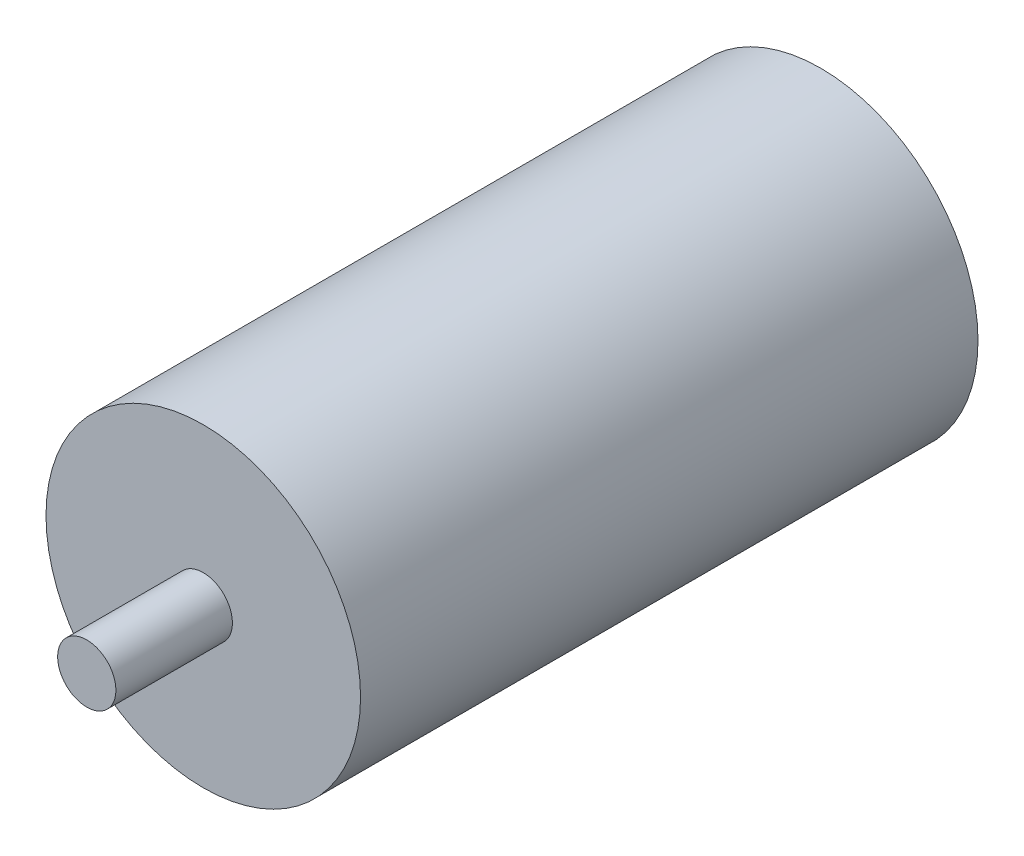
ISO-10303-21;
HEADER;
FILE_DESCRIPTION(('STEP AP214'),'2;1');
FILE_NAME('part.step','',(''),(''),'','','');
FILE_SCHEMA(('AUTOMOTIVE_DESIGN { 1 0 10303 214 1 1 1 1 }'));
ENDSEC;
DATA;
#1=APPLICATION_CONTEXT('core data for automotive mechanical design processes');
#2=APPLICATION_PROTOCOL_DEFINITION('international standard','automotive_design',2000,#1);
#3=PRODUCT_CONTEXT('',#1,'mechanical');
#4=PRODUCT('Part','Part','',(#3));
#5=PRODUCT_RELATED_PRODUCT_CATEGORY('part','',(#4));
#6=PRODUCT_DEFINITION_FORMATION('','',#4);
#7=PRODUCT_DEFINITION_CONTEXT('part definition',#1,'design');
#8=PRODUCT_DEFINITION('design','',#6,#7);
#9=PRODUCT_DEFINITION_SHAPE('','',#8);
#10=(LENGTH_UNIT() NAMED_UNIT(*) SI_UNIT(.MILLI.,.METRE.));
#11=(NAMED_UNIT(*) PLANE_ANGLE_UNIT() SI_UNIT($,.RADIAN.));
#12=(NAMED_UNIT(*) SI_UNIT($,.STERADIAN.) SOLID_ANGLE_UNIT());
#13=UNCERTAINTY_MEASURE_WITH_UNIT(LENGTH_MEASURE(1.E-05),#10,'distance_accuracy_value','');
#14=(GEOMETRIC_REPRESENTATION_CONTEXT(3) GLOBAL_UNCERTAINTY_ASSIGNED_CONTEXT((#13)) GLOBAL_UNIT_ASSIGNED_CONTEXT((#10,
#11,#12)) REPRESENTATION_CONTEXT('',''));
#15=CARTESIAN_POINT('',(0.,0.,0.));
#16=DIRECTION('',(0.,0.,1.));
#17=DIRECTION('',(1.,0.,0.));
#18=AXIS2_PLACEMENT_3D('',#15,#16,#17);
#19=CARTESIAN_POINT('',(0.,0.,265.));
#20=DIRECTION('',(0.,0.,-1.));
#21=DIRECTION('',(-1.,0.,0.));
#22=AXIS2_PLACEMENT_3D('',#19,#20,#21);
#23=CYLINDRICAL_SURFACE('',#22,67.5);
#24=CARTESIAN_POINT('',(0.,0.,265.));
#25=DIRECTION('',(0.,0.,1.));
#26=DIRECTION('',(1.,0.,0.));
#27=AXIS2_PLACEMENT_3D('',#24,#25,#26);
#28=CIRCLE('',#27,67.5);
#29=CARTESIAN_POINT('',(67.5,0.,265.));
#30=VERTEX_POINT('',#29);
#31=EDGE_CURVE('E43',#30,#30,#28,.T.);
#32=ORIENTED_EDGE('',*,*,#31,.F.);
#33=EDGE_LOOP('',(#32));
#34=FACE_BOUND('',#33,.T.);
#35=CARTESIAN_POINT('',(0.,0.,0.));
#36=DIRECTION('',(0.,0.,1.));
#37=DIRECTION('',(1.,0.,0.));
#38=AXIS2_PLACEMENT_3D('',#35,#36,#37);
#39=CIRCLE('',#38,67.5);
#40=CARTESIAN_POINT('',(67.5,0.,0.));
#41=VERTEX_POINT('',#40);
#42=EDGE_CURVE('E39',#41,#41,#39,.T.);
#43=ORIENTED_EDGE('',*,*,#42,.T.);
#44=EDGE_LOOP('',(#43));
#45=FACE_BOUND('',#44,.T.);
#46=ADVANCED_FACE('F36',(#34,#45),#23,.T.);
#47=CARTESIAN_POINT('',(0.,0.,265.));
#48=DIRECTION('',(0.,0.,1.));
#49=DIRECTION('',(1.,0.,0.));
#50=AXIS2_PLACEMENT_3D('',#47,#48,#49);
#51=PLANE('',#50);
#52=CARTESIAN_POINT('',(0.,0.,265.));
#53=DIRECTION('',(0.,0.,1.));
#54=DIRECTION('',(1.,0.,0.));
#55=AXIS2_PLACEMENT_3D('',#52,#53,#54);
#56=CIRCLE('',#55,12.5);
#57=CARTESIAN_POINT('',(12.5,0.,265.));
#58=VERTEX_POINT('',#57);
#59=EDGE_CURVE('E10',#58,#58,#56,.T.);
#60=ORIENTED_EDGE('',*,*,#59,.F.);
#61=EDGE_LOOP('',(#60));
#62=FACE_BOUND('',#61,.T.);
#63=ORIENTED_EDGE('',*,*,#31,.T.);
#64=EDGE_LOOP('',(#63));
#65=FACE_BOUND('',#64,.T.);
#66=ADVANCED_FACE('F60',(#62,#65),#51,.T.);
#67=CARTESIAN_POINT('',(0.,0.,0.));
#68=DIRECTION('',(0.,0.,1.));
#69=DIRECTION('',(1.,0.,0.));
#70=AXIS2_PLACEMENT_3D('',#67,#68,#69);
#71=PLANE('',#70);
#72=ORIENTED_EDGE('',*,*,#42,.F.);
#73=EDGE_LOOP('',(#72));
#74=FACE_BOUND('',#73,.T.);
#75=ADVANCED_FACE('F57',(#74),#71,.F.);
#76=CARTESIAN_POINT('',(0.,0.,315.));
#77=DIRECTION('',(0.,0.,-1.));
#78=DIRECTION('',(-1.,0.,0.));
#79=AXIS2_PLACEMENT_3D('',#76,#77,#78);
#80=CYLINDRICAL_SURFACE('',#79,12.5);
#81=CARTESIAN_POINT('',(0.,0.,315.));
#82=DIRECTION('',(0.,0.,1.));
#83=DIRECTION('',(1.,0.,0.));
#84=AXIS2_PLACEMENT_3D('',#81,#82,#83);
#85=CIRCLE('',#84,12.5);
#86=CARTESIAN_POINT('',(12.5,0.,315.));
#87=VERTEX_POINT('',#86);
#88=EDGE_CURVE('E49',#87,#87,#85,.T.);
#89=ORIENTED_EDGE('',*,*,#88,.F.);
#90=EDGE_LOOP('',(#89));
#91=FACE_BOUND('',#90,.T.);
#92=ORIENTED_EDGE('',*,*,#59,.T.);
#93=EDGE_LOOP('',(#92));
#94=FACE_BOUND('',#93,.T.);
#95=ADVANCED_FACE('F59',(#91,#94),#80,.T.);
#96=CARTESIAN_POINT('',(0.,0.,315.));
#97=DIRECTION('',(0.,0.,1.));
#98=DIRECTION('',(1.,0.,0.));
#99=AXIS2_PLACEMENT_3D('',#96,#97,#98);
#100=PLANE('',#99);
#101=ORIENTED_EDGE('',*,*,#88,.T.);
#102=EDGE_LOOP('',(#101));
#103=FACE_BOUND('',#102,.T.);
#104=ADVANCED_FACE('F65',(#103),#100,.T.);
#105=CLOSED_SHELL('',(#46,#66,#75,#95,#104));
#106=MANIFOLD_SOLID_BREP('B2',#105);
#107=ADVANCED_BREP_SHAPE_REPRESENTATION('',(#18,#106),#14);
#108=SHAPE_DEFINITION_REPRESENTATION(#9,#107);
ENDSEC;
END-ISO-10303-21;
